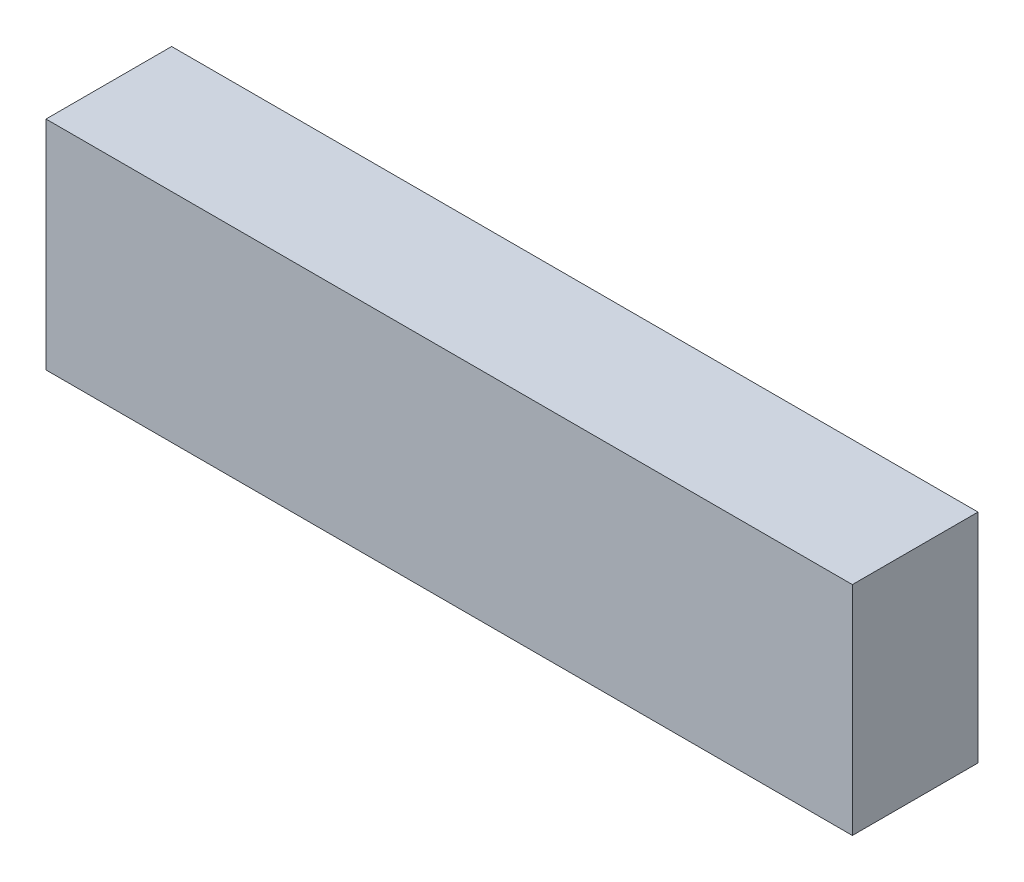
ISO-10303-21;
HEADER;
FILE_DESCRIPTION(('STEP AP214'),'2;1');
FILE_NAME('part.step','',(''),(''),'','','');
FILE_SCHEMA(('AUTOMOTIVE_DESIGN { 1 0 10303 214 1 1 1 1 }'));
ENDSEC;
DATA;
#1=APPLICATION_CONTEXT('core data for automotive mechanical design processes');
#2=APPLICATION_PROTOCOL_DEFINITION('international standard','automotive_design',2000,#1);
#3=PRODUCT_CONTEXT('',#1,'mechanical');
#4=PRODUCT('Part','Part','',(#3));
#5=PRODUCT_RELATED_PRODUCT_CATEGORY('part','',(#4));
#6=PRODUCT_DEFINITION_FORMATION('','',#4);
#7=PRODUCT_DEFINITION_CONTEXT('part definition',#1,'design');
#8=PRODUCT_DEFINITION('design','',#6,#7);
#9=PRODUCT_DEFINITION_SHAPE('','',#8);
#10=(LENGTH_UNIT() NAMED_UNIT(*) SI_UNIT(.MILLI.,.METRE.));
#11=(NAMED_UNIT(*) PLANE_ANGLE_UNIT() SI_UNIT($,.RADIAN.));
#12=(NAMED_UNIT(*) SI_UNIT($,.STERADIAN.) SOLID_ANGLE_UNIT());
#13=UNCERTAINTY_MEASURE_WITH_UNIT(LENGTH_MEASURE(1.E-05),#10,'distance_accuracy_value','');
#14=(GEOMETRIC_REPRESENTATION_CONTEXT(3) GLOBAL_UNCERTAINTY_ASSIGNED_CONTEXT((#13)) GLOBAL_UNIT_ASSIGNED_CONTEXT((#10,
#11,#12)) REPRESENTATION_CONTEXT('',''));
#15=CARTESIAN_POINT('',(0.,0.,0.));
#16=DIRECTION('',(0.,0.,1.));
#17=DIRECTION('',(1.,0.,0.));
#18=AXIS2_PLACEMENT_3D('',#15,#16,#17);
#19=CARTESIAN_POINT('',(32.5045000000004,-33.57,7.25));
#20=DIRECTION('',(1.,0.,0.));
#21=DIRECTION('',(0.,0.,-1.));
#22=AXIS2_PLACEMENT_3D('',#19,#20,#21);
#23=PLANE('',#22);
#24=DIRECTION('',(0.,-1.,0.));
#25=VECTOR('',#24,1.);
#26=CARTESIAN_POINT('',(32.5045000000004,-33.57,0.));
#27=LINE('',#26,#25);
#28=CARTESIAN_POINT('',(32.5045000000004,-33.57,0.));
#29=VERTEX_POINT('',#28);
#30=CARTESIAN_POINT('',(32.5045000000004,-46.11,0.));
#31=VERTEX_POINT('',#30);
#32=EDGE_CURVE('E128',#29,#31,#27,.T.);
#33=ORIENTED_EDGE('',*,*,#32,.T.);
#34=DIRECTION('',(0.,0.,-1.));
#35=VECTOR('',#34,1.);
#36=CARTESIAN_POINT('',(32.5045000000004,-46.11,7.25));
#37=LINE('',#36,#35);
#38=CARTESIAN_POINT('',(32.5045000000004,-46.11,7.25));
#39=VERTEX_POINT('',#38);
#40=EDGE_CURVE('E11',#39,#31,#37,.T.);
#41=ORIENTED_EDGE('',*,*,#40,.F.);
#42=DIRECTION('',(0.,-1.,0.));
#43=VECTOR('',#42,1.);
#44=CARTESIAN_POINT('',(32.5045000000004,-33.57,7.25));
#45=LINE('',#44,#43);
#46=CARTESIAN_POINT('',(32.5045000000004,-33.57,7.25));
#47=VERTEX_POINT('',#46);
#48=EDGE_CURVE('E148',#47,#39,#45,.T.);
#49=ORIENTED_EDGE('',*,*,#48,.F.);
#50=DIRECTION('',(0.,0.,-1.));
#51=VECTOR('',#50,1.);
#52=CARTESIAN_POINT('',(32.5045000000004,-33.57,7.25));
#53=LINE('',#52,#51);
#54=EDGE_CURVE('E153',#47,#29,#53,.T.);
#55=ORIENTED_EDGE('',*,*,#54,.T.);
#56=EDGE_LOOP('',(#33,#41,#49,#55));
#57=FACE_BOUND('',#56,.T.);
#58=ADVANCED_FACE('F32',(#57),#23,.F.);
#59=CARTESIAN_POINT('',(32.5045000000004,-46.11,7.25));
#60=DIRECTION('',(0.,1.,0.));
#61=DIRECTION('',(0.,0.,1.));
#62=AXIS2_PLACEMENT_3D('',#59,#60,#61);
#63=PLANE('',#62);
#64=DIRECTION('',(1.,0.,0.));
#65=VECTOR('',#64,1.);
#66=CARTESIAN_POINT('',(32.5045000000004,-46.11,0.));
#67=LINE('',#66,#65);
#68=CARTESIAN_POINT('',(79.0368014902547,-46.11,0.));
#69=VERTEX_POINT('',#68);
#70=EDGE_CURVE('E132',#31,#69,#67,.T.);
#71=ORIENTED_EDGE('',*,*,#70,.T.);
#72=DIRECTION('',(0.,0.,-1.));
#73=VECTOR('',#72,1.);
#74=CARTESIAN_POINT('',(79.0368014902547,-46.11,7.25));
#75=LINE('',#74,#73);
#76=CARTESIAN_POINT('',(79.0368014902547,-46.11,7.25));
#77=VERTEX_POINT('',#76);
#78=EDGE_CURVE('E39',#77,#69,#75,.T.);
#79=ORIENTED_EDGE('',*,*,#78,.F.);
#80=DIRECTION('',(1.,0.,0.));
#81=VECTOR('',#80,1.);
#82=CARTESIAN_POINT('',(32.5045000000004,-46.11,7.25));
#83=LINE('',#82,#81);
#84=EDGE_CURVE('E83',#39,#77,#83,.T.);
#85=ORIENTED_EDGE('',*,*,#84,.F.);
#86=ORIENTED_EDGE('',*,*,#40,.T.);
#87=EDGE_LOOP('',(#71,#79,#85,#86));
#88=FACE_BOUND('',#87,.T.);
#89=ADVANCED_FACE('F182',(#88),#63,.F.);
#90=CARTESIAN_POINT('',(79.0368014902547,-33.57,7.25));
#91=DIRECTION('',(-1.,0.,0.));
#92=DIRECTION('',(0.,0.,1.));
#93=AXIS2_PLACEMENT_3D('',#90,#91,#92);
#94=PLANE('',#93);
#95=DIRECTION('',(0.,1.,0.));
#96=VECTOR('',#95,1.);
#97=CARTESIAN_POINT('',(79.0368014902547,-33.57,0.));
#98=LINE('',#97,#96);
#99=CARTESIAN_POINT('',(79.0368014902547,-33.57,0.));
#100=VERTEX_POINT('',#99);
#101=EDGE_CURVE('E156',#69,#100,#98,.T.);
#102=ORIENTED_EDGE('',*,*,#101,.T.);
#103=DIRECTION('',(0.,0.,-1.));
#104=VECTOR('',#103,1.);
#105=CARTESIAN_POINT('',(79.0368014902547,-33.57,7.25));
#106=LINE('',#105,#104);
#107=CARTESIAN_POINT('',(79.0368014902547,-33.57,7.25));
#108=VERTEX_POINT('',#107);
#109=EDGE_CURVE('E160',#108,#100,#106,.T.);
#110=ORIENTED_EDGE('',*,*,#109,.F.);
#111=DIRECTION('',(0.,1.,0.));
#112=VECTOR('',#111,1.);
#113=CARTESIAN_POINT('',(79.0368014902547,-33.57,7.25));
#114=LINE('',#113,#112);
#115=EDGE_CURVE('E151',#77,#108,#114,.T.);
#116=ORIENTED_EDGE('',*,*,#115,.F.);
#117=ORIENTED_EDGE('',*,*,#78,.T.);
#118=EDGE_LOOP('',(#102,#110,#116,#117));
#119=FACE_BOUND('',#118,.T.);
#120=ADVANCED_FACE('F165',(#119),#94,.F.);
#121=CARTESIAN_POINT('',(32.5045000000004,-33.57,7.25));
#122=DIRECTION('',(0.,-1.,0.));
#123=DIRECTION('',(0.,0.,-1.));
#124=AXIS2_PLACEMENT_3D('',#121,#122,#123);
#125=PLANE('',#124);
#126=DIRECTION('',(-1.,0.,0.));
#127=VECTOR('',#126,1.);
#128=CARTESIAN_POINT('',(32.5045000000004,-33.57,0.));
#129=LINE('',#128,#127);
#130=EDGE_CURVE('E76',#100,#29,#129,.T.);
#131=ORIENTED_EDGE('',*,*,#130,.T.);
#132=ORIENTED_EDGE('',*,*,#54,.F.);
#133=DIRECTION('',(-1.,0.,0.));
#134=VECTOR('',#133,1.);
#135=CARTESIAN_POINT('',(32.5045000000004,-33.57,7.25));
#136=LINE('',#135,#134);
#137=EDGE_CURVE('E55',#108,#47,#136,.T.);
#138=ORIENTED_EDGE('',*,*,#137,.F.);
#139=ORIENTED_EDGE('',*,*,#109,.T.);
#140=EDGE_LOOP('',(#131,#132,#138,#139));
#141=FACE_BOUND('',#140,.T.);
#142=ADVANCED_FACE('F173',(#141),#125,.F.);
#143=CARTESIAN_POINT('',(0.,0.,7.25));
#144=DIRECTION('',(0.,0.,1.));
#145=DIRECTION('',(1.,0.,0.));
#146=AXIS2_PLACEMENT_3D('',#143,#144,#145);
#147=PLANE('',#146);
#148=ORIENTED_EDGE('',*,*,#48,.T.);
#149=ORIENTED_EDGE('',*,*,#84,.T.);
#150=ORIENTED_EDGE('',*,*,#115,.T.);
#151=ORIENTED_EDGE('',*,*,#137,.T.);
#152=EDGE_LOOP('',(#148,#149,#150,#151));
#153=FACE_BOUND('',#152,.T.);
#154=ADVANCED_FACE('F175',(#153),#147,.T.);
#155=CARTESIAN_POINT('',(0.,0.,0.));
#156=DIRECTION('',(0.,0.,1.));
#157=DIRECTION('',(1.,0.,0.));
#158=AXIS2_PLACEMENT_3D('',#155,#156,#157);
#159=PLANE('',#158);
#160=DIRECTION('',(-1.,0.,0.));
#161=VECTOR('',#160,1.);
#162=CARTESIAN_POINT('',(32.5045000000004,-34.07,0.));
#163=LINE('',#162,#161);
#164=CARTESIAN_POINT('',(78.5368014902547,-34.07,0.));
#165=VERTEX_POINT('',#164);
#166=CARTESIAN_POINT('',(33.0045000000004,-34.07,0.));
#167=VERTEX_POINT('',#166);
#168=EDGE_CURVE('E123',#165,#167,#163,.T.);
#169=ORIENTED_EDGE('',*,*,#168,.T.);
#170=DIRECTION('',(0.,-1.,0.));
#171=VECTOR('',#170,1.);
#172=CARTESIAN_POINT('',(33.0045000000004,-33.57,0.));
#173=LINE('',#172,#171);
#174=CARTESIAN_POINT('',(33.0045000000004,-45.61,0.));
#175=VERTEX_POINT('',#174);
#176=EDGE_CURVE('E142',#167,#175,#173,.T.);
#177=ORIENTED_EDGE('',*,*,#176,.T.);
#178=DIRECTION('',(1.,0.,0.));
#179=VECTOR('',#178,1.);
#180=CARTESIAN_POINT('',(32.5045000000004,-45.61,0.));
#181=LINE('',#180,#179);
#182=CARTESIAN_POINT('',(78.5368014902547,-45.61,0.));
#183=VERTEX_POINT('',#182);
#184=EDGE_CURVE('E127',#175,#183,#181,.T.);
#185=ORIENTED_EDGE('',*,*,#184,.T.);
#186=DIRECTION('',(0.,1.,0.));
#187=VECTOR('',#186,1.);
#188=CARTESIAN_POINT('',(78.5368014902547,-33.57,0.));
#189=LINE('',#188,#187);
#190=EDGE_CURVE('E46',#183,#165,#189,.T.);
#191=ORIENTED_EDGE('',*,*,#190,.T.);
#192=EDGE_LOOP('',(#169,#177,#185,#191));
#193=FACE_BOUND('',#192,.T.);
#194=ORIENTED_EDGE('',*,*,#32,.F.);
#195=ORIENTED_EDGE('',*,*,#130,.F.);
#196=ORIENTED_EDGE('',*,*,#101,.F.);
#197=ORIENTED_EDGE('',*,*,#70,.F.);
#198=EDGE_LOOP('',(#194,#195,#196,#197));
#199=FACE_BOUND('',#198,.T.);
#200=ADVANCED_FACE('F169',(#193,#199),#159,.F.);
#201=CARTESIAN_POINT('',(33.0045000000004,-33.57,7.25));
#202=DIRECTION('',(1.,0.,0.));
#203=DIRECTION('',(0.,0.,-1.));
#204=AXIS2_PLACEMENT_3D('',#201,#202,#203);
#205=PLANE('',#204);
#206=ORIENTED_EDGE('',*,*,#176,.F.);
#207=DIRECTION('',(0.,0.,-1.));
#208=VECTOR('',#207,1.);
#209=CARTESIAN_POINT('',(33.0045000000004,-34.07,7.25));
#210=LINE('',#209,#208);
#211=CARTESIAN_POINT('',(33.0045000000004,-34.07,7.05));
#212=VERTEX_POINT('',#211);
#213=EDGE_CURVE('E122',#212,#167,#210,.T.);
#214=ORIENTED_EDGE('',*,*,#213,.F.);
#215=DIRECTION('',(0.,-1.,0.));
#216=VECTOR('',#215,1.);
#217=CARTESIAN_POINT('',(33.0045000000004,-33.57,7.05));
#218=LINE('',#217,#216);
#219=CARTESIAN_POINT('',(33.0045000000004,-45.61,7.05));
#220=VERTEX_POINT('',#219);
#221=EDGE_CURVE('E110',#212,#220,#218,.T.);
#222=ORIENTED_EDGE('',*,*,#221,.T.);
#223=DIRECTION('',(0.,0.,-1.));
#224=VECTOR('',#223,1.);
#225=CARTESIAN_POINT('',(33.0045000000004,-45.61,7.25));
#226=LINE('',#225,#224);
#227=EDGE_CURVE('E120',#220,#175,#226,.T.);
#228=ORIENTED_EDGE('',*,*,#227,.T.);
#229=EDGE_LOOP('',(#206,#214,#222,#228));
#230=FACE_BOUND('',#229,.T.);
#231=ADVANCED_FACE('F119',(#230),#205,.T.);
#232=CARTESIAN_POINT('',(32.5045000000004,-45.61,7.25));
#233=DIRECTION('',(0.,1.,0.));
#234=DIRECTION('',(0.,0.,1.));
#235=AXIS2_PLACEMENT_3D('',#232,#233,#234);
#236=PLANE('',#235);
#237=ORIENTED_EDGE('',*,*,#184,.F.);
#238=ORIENTED_EDGE('',*,*,#227,.F.);
#239=DIRECTION('',(1.,0.,0.));
#240=VECTOR('',#239,1.);
#241=CARTESIAN_POINT('',(32.5045000000004,-45.61,7.05));
#242=LINE('',#241,#240);
#243=CARTESIAN_POINT('',(78.5368014902547,-45.61,7.05));
#244=VERTEX_POINT('',#243);
#245=EDGE_CURVE('E106',#220,#244,#242,.T.);
#246=ORIENTED_EDGE('',*,*,#245,.T.);
#247=DIRECTION('',(0.,0.,-1.));
#248=VECTOR('',#247,1.);
#249=CARTESIAN_POINT('',(78.5368014902547,-45.61,7.25));
#250=LINE('',#249,#248);
#251=EDGE_CURVE('E129',#244,#183,#250,.T.);
#252=ORIENTED_EDGE('',*,*,#251,.T.);
#253=EDGE_LOOP('',(#237,#238,#246,#252));
#254=FACE_BOUND('',#253,.T.);
#255=ADVANCED_FACE('F125',(#254),#236,.T.);
#256=CARTESIAN_POINT('',(78.5368014902547,-33.57,7.25));
#257=DIRECTION('',(-1.,0.,0.));
#258=DIRECTION('',(0.,0.,1.));
#259=AXIS2_PLACEMENT_3D('',#256,#257,#258);
#260=PLANE('',#259);
#261=ORIENTED_EDGE('',*,*,#190,.F.);
#262=ORIENTED_EDGE('',*,*,#251,.F.);
#263=DIRECTION('',(0.,1.,0.));
#264=VECTOR('',#263,1.);
#265=CARTESIAN_POINT('',(78.5368014902547,-33.57,7.05));
#266=LINE('',#265,#264);
#267=CARTESIAN_POINT('',(78.5368014902547,-34.07,7.05));
#268=VERTEX_POINT('',#267);
#269=EDGE_CURVE('E111',#244,#268,#266,.T.);
#270=ORIENTED_EDGE('',*,*,#269,.T.);
#271=DIRECTION('',(0.,0.,-1.));
#272=VECTOR('',#271,1.);
#273=CARTESIAN_POINT('',(78.5368014902547,-34.07,7.25));
#274=LINE('',#273,#272);
#275=EDGE_CURVE('E134',#268,#165,#274,.T.);
#276=ORIENTED_EDGE('',*,*,#275,.T.);
#277=EDGE_LOOP('',(#261,#262,#270,#276));
#278=FACE_BOUND('',#277,.T.);
#279=ADVANCED_FACE('F230',(#278),#260,.T.);
#280=CARTESIAN_POINT('',(32.5045000000004,-34.07,7.25));
#281=DIRECTION('',(0.,-1.,0.));
#282=DIRECTION('',(0.,0.,-1.));
#283=AXIS2_PLACEMENT_3D('',#280,#281,#282);
#284=PLANE('',#283);
#285=ORIENTED_EDGE('',*,*,#168,.F.);
#286=ORIENTED_EDGE('',*,*,#275,.F.);
#287=DIRECTION('',(-1.,0.,0.));
#288=VECTOR('',#287,1.);
#289=CARTESIAN_POINT('',(32.5045000000004,-34.07,7.05));
#290=LINE('',#289,#288);
#291=EDGE_CURVE('E137',#268,#212,#290,.T.);
#292=ORIENTED_EDGE('',*,*,#291,.T.);
#293=ORIENTED_EDGE('',*,*,#213,.T.);
#294=EDGE_LOOP('',(#285,#286,#292,#293));
#295=FACE_BOUND('',#294,.T.);
#296=ADVANCED_FACE('F239',(#295),#284,.T.);
#297=CARTESIAN_POINT('',(0.,0.,7.05));
#298=DIRECTION('',(0.,0.,1.));
#299=DIRECTION('',(1.,0.,0.));
#300=AXIS2_PLACEMENT_3D('',#297,#298,#299);
#301=PLANE('',#300);
#302=ORIENTED_EDGE('',*,*,#221,.F.);
#303=ORIENTED_EDGE('',*,*,#291,.F.);
#304=ORIENTED_EDGE('',*,*,#269,.F.);
#305=ORIENTED_EDGE('',*,*,#245,.F.);
#306=EDGE_LOOP('',(#302,#303,#304,#305));
#307=FACE_BOUND('',#306,.T.);
#308=ADVANCED_FACE('F108',(#307),#301,.F.);
#309=CLOSED_SHELL('',(#58,#89,#120,#142,#154,#200,#231,#255,#279,#296,#308));
#310=MANIFOLD_SOLID_BREP('B2',#309);
#311=ADVANCED_BREP_SHAPE_REPRESENTATION('',(#18,#310),#14);
#312=SHAPE_DEFINITION_REPRESENTATION(#9,#311);
ENDSEC;
END-ISO-10303-21;
